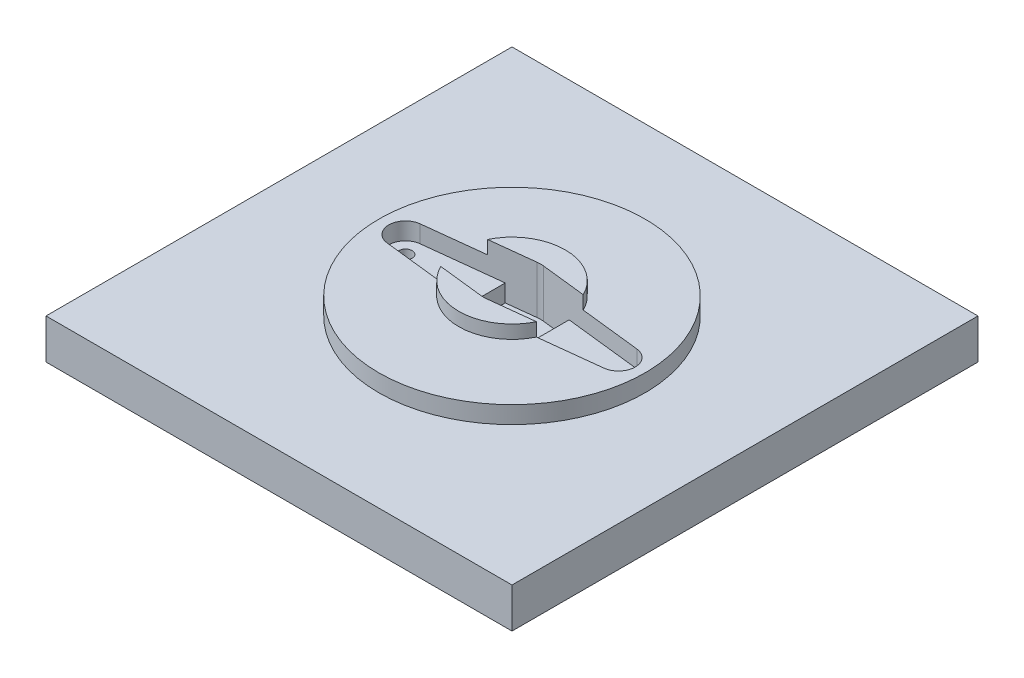
ISO-10303-21;
HEADER;
FILE_DESCRIPTION(('STEP AP214'),'2;1');
FILE_NAME('part.step','',(''),(''),'','','');
FILE_SCHEMA(('AUTOMOTIVE_DESIGN { 1 0 10303 214 1 1 1 1 }'));
ENDSEC;
DATA;
#1=APPLICATION_CONTEXT('core data for automotive mechanical design processes');
#2=APPLICATION_PROTOCOL_DEFINITION('international standard','automotive_design',2000,#1);
#3=PRODUCT_CONTEXT('',#1,'mechanical');
#4=PRODUCT('Part','Part','',(#3));
#5=PRODUCT_RELATED_PRODUCT_CATEGORY('part','',(#4));
#6=PRODUCT_DEFINITION_FORMATION('','',#4);
#7=PRODUCT_DEFINITION_CONTEXT('part definition',#1,'design');
#8=PRODUCT_DEFINITION('design','',#6,#7);
#9=PRODUCT_DEFINITION_SHAPE('','',#8);
#10=(LENGTH_UNIT() NAMED_UNIT(*) SI_UNIT(.MILLI.,.METRE.));
#11=(NAMED_UNIT(*) PLANE_ANGLE_UNIT() SI_UNIT($,.RADIAN.));
#12=(NAMED_UNIT(*) SI_UNIT($,.STERADIAN.) SOLID_ANGLE_UNIT());
#13=UNCERTAINTY_MEASURE_WITH_UNIT(LENGTH_MEASURE(1.E-05),#10,'distance_accuracy_value','');
#14=(GEOMETRIC_REPRESENTATION_CONTEXT(3) GLOBAL_UNCERTAINTY_ASSIGNED_CONTEXT((#13)) GLOBAL_UNIT_ASSIGNED_CONTEXT((#10,
#11,#12)) REPRESENTATION_CONTEXT('',''));
#15=CARTESIAN_POINT('',(0.,0.,0.));
#16=DIRECTION('',(0.,0.,1.));
#17=DIRECTION('',(1.,0.,0.));
#18=AXIS2_PLACEMENT_3D('',#15,#16,#17);
#19=CARTESIAN_POINT('',(0.,8.6,0.));
#20=DIRECTION('',(0.,1.,0.));
#21=DIRECTION('',(0.,0.,1.));
#22=AXIS2_PLACEMENT_3D('',#19,#20,#21);
#23=PLANE('',#22);
#24=CARTESIAN_POINT('',(0.,8.6,0.));
#25=DIRECTION('',(0.,1.,0.));
#26=DIRECTION('',(0.,0.,1.));
#27=AXIS2_PLACEMENT_3D('',#24,#25,#26);
#28=CIRCLE('',#27,20.);
#29=CARTESIAN_POINT('',(0.,8.6,20.));
#30=VERTEX_POINT('',#29);
#31=EDGE_CURVE('E385',#30,#30,#28,.T.);
#32=ORIENTED_EDGE('',*,*,#31,.T.);
#33=EDGE_LOOP('',(#32));
#34=FACE_BOUND('',#33,.T.);
#35=DIRECTION('',(-0.99365172470036,0.,0.1125));
#36=VECTOR('',#35,1.);
#37=CARTESIAN_POINT('',(-16.28125,8.6,-2.4841293117509));
#38=LINE('',#37,#36);
#39=CARTESIAN_POINT('',(-7.18703382678967,8.6,-3.51376504231302));
#40=VERTEX_POINT('',#39);
#41=CARTESIAN_POINT('',(-16.28125,8.6,-2.4841293117509));
#42=VERTEX_POINT('',#41);
#43=EDGE_CURVE('E327',#40,#42,#38,.T.);
#44=ORIENTED_EDGE('',*,*,#43,.F.);
#45=CARTESIAN_POINT('',(0.,8.6,0.));
#46=DIRECTION('',(0.,1.,0.));
#47=DIRECTION('',(0.,0.,1.));
#48=AXIS2_PLACEMENT_3D('',#45,#46,#47);
#49=CIRCLE('',#48,8.);
#50=CARTESIAN_POINT('',(7.18703382678967,8.6,-3.51376504231302));
#51=VERTEX_POINT('',#50);
#52=EDGE_CURVE('E56',#51,#40,#49,.T.);
#53=ORIENTED_EDGE('',*,*,#52,.F.);
#54=DIRECTION('',(-0.99365172470036,0.,-0.1125));
#55=VECTOR('',#54,1.);
#56=CARTESIAN_POINT('',(0.48375,8.6,-4.27270241621155));
#57=LINE('',#56,#55);
#58=CARTESIAN_POINT('',(16.28125,8.6,-2.4841293117509));
#59=VERTEX_POINT('',#58);
#60=EDGE_CURVE('E322',#59,#51,#57,.T.);
#61=ORIENTED_EDGE('',*,*,#60,.F.);
#62=CARTESIAN_POINT('',(16.,8.6,0.));
#63=DIRECTION('',(0.,1.,0.));
#64=DIRECTION('',(0.,0.,1.));
#65=AXIS2_PLACEMENT_3D('',#62,#63,#64);
#66=CIRCLE('',#65,2.5);
#67=CARTESIAN_POINT('',(16.28125,8.6,2.4841293117509));
#68=VERTEX_POINT('',#67);
#69=EDGE_CURVE('E319',#68,#59,#66,.T.);
#70=ORIENTED_EDGE('',*,*,#69,.F.);
#71=DIRECTION('',(0.99365172470036,0.,-0.1125));
#72=VECTOR('',#71,1.);
#73=CARTESIAN_POINT('',(0.48375,8.6,4.27270241621155));
#74=LINE('',#73,#72);
#75=CARTESIAN_POINT('',(7.18703382678967,8.6,3.51376504231302));
#76=VERTEX_POINT('',#75);
#77=EDGE_CURVE('E336',#76,#68,#74,.T.);
#78=ORIENTED_EDGE('',*,*,#77,.F.);
#79=CARTESIAN_POINT('',(0.,8.6,0.));
#80=DIRECTION('',(0.,1.,0.));
#81=DIRECTION('',(0.,0.,1.));
#82=AXIS2_PLACEMENT_3D('',#79,#80,#81);
#83=CIRCLE('',#82,8.);
#84=CARTESIAN_POINT('',(-7.18703382678967,8.6,3.51376504231302));
#85=VERTEX_POINT('',#84);
#86=EDGE_CURVE('E64',#85,#76,#83,.T.);
#87=ORIENTED_EDGE('',*,*,#86,.F.);
#88=DIRECTION('',(0.99365172470036,0.,0.1125));
#89=VECTOR('',#88,1.);
#90=CARTESIAN_POINT('',(-16.28125,8.6,2.4841293117509));
#91=LINE('',#90,#89);
#92=CARTESIAN_POINT('',(-16.28125,8.6,2.4841293117509));
#93=VERTEX_POINT('',#92);
#94=EDGE_CURVE('E333',#93,#85,#91,.T.);
#95=ORIENTED_EDGE('',*,*,#94,.F.);
#96=CARTESIAN_POINT('',(-16.,8.6,0.));
#97=DIRECTION('',(0.,1.,0.));
#98=DIRECTION('',(0.,0.,1.));
#99=AXIS2_PLACEMENT_3D('',#96,#97,#98);
#100=CIRCLE('',#99,2.5);
#101=EDGE_CURVE('E330',#42,#93,#100,.T.);
#102=ORIENTED_EDGE('',*,*,#101,.F.);
#103=EDGE_LOOP('',(#44,#53,#61,#70,#78,#87,#95,#102));
#104=FACE_BOUND('',#103,.T.);
#105=ADVANCED_FACE('F39',(#34,#104),#23,.T.);
#106=CARTESIAN_POINT('',(0.,0.,0.));
#107=DIRECTION('',(0.,1.,0.));
#108=DIRECTION('',(0.,0.,1.));
#109=AXIS2_PLACEMENT_3D('',#106,#107,#108);
#110=PLANE('',#109);
#111=DIRECTION('',(0.,0.,-1.));
#112=VECTOR('',#111,1.);
#113=CARTESIAN_POINT('',(35.,0.,-35.));
#114=LINE('',#113,#112);
#115=CARTESIAN_POINT('',(35.,0.,35.));
#116=VERTEX_POINT('',#115);
#117=CARTESIAN_POINT('',(35.,0.,-35.));
#118=VERTEX_POINT('',#117);
#119=EDGE_CURVE('E388',#116,#118,#114,.T.);
#120=ORIENTED_EDGE('',*,*,#119,.F.);
#121=DIRECTION('',(1.,0.,0.));
#122=VECTOR('',#121,1.);
#123=CARTESIAN_POINT('',(-35.,0.,35.));
#124=LINE('',#123,#122);
#125=CARTESIAN_POINT('',(-35.,0.,35.));
#126=VERTEX_POINT('',#125);
#127=EDGE_CURVE('E395',#126,#116,#124,.T.);
#128=ORIENTED_EDGE('',*,*,#127,.F.);
#129=DIRECTION('',(0.,0.,1.));
#130=VECTOR('',#129,1.);
#131=CARTESIAN_POINT('',(-35.,0.,-35.));
#132=LINE('',#131,#130);
#133=CARTESIAN_POINT('',(-35.,0.,-35.));
#134=VERTEX_POINT('',#133);
#135=EDGE_CURVE('E411',#134,#126,#132,.T.);
#136=ORIENTED_EDGE('',*,*,#135,.F.);
#137=DIRECTION('',(-1.,0.,0.));
#138=VECTOR('',#137,1.);
#139=CARTESIAN_POINT('',(-35.,0.,-35.));
#140=LINE('',#139,#138);
#141=EDGE_CURVE('E408',#118,#134,#140,.T.);
#142=ORIENTED_EDGE('',*,*,#141,.F.);
#143=EDGE_LOOP('',(#120,#128,#136,#142));
#144=FACE_BOUND('',#143,.T.);
#145=CARTESIAN_POINT('',(16.,0.,0.));
#146=DIRECTION('',(0.,1.,0.));
#147=DIRECTION('',(0.,0.,1.));
#148=AXIS2_PLACEMENT_3D('',#145,#146,#147);
#149=CIRCLE('',#148,3.5);
#150=CARTESIAN_POINT('',(16.,0.,3.5));
#151=VERTEX_POINT('',#150);
#152=EDGE_CURVE('E260',#151,#151,#149,.T.);
#153=ORIENTED_EDGE('',*,*,#152,.T.);
#154=EDGE_LOOP('',(#153));
#155=FACE_BOUND('',#154,.T.);
#156=CARTESIAN_POINT('',(-16.,0.,0.));
#157=DIRECTION('',(0.,-1.,0.));
#158=DIRECTION('',(0.,0.,-1.));
#159=AXIS2_PLACEMENT_3D('',#156,#157,#158);
#160=CIRCLE('',#159,3.5);
#161=CARTESIAN_POINT('',(-16.,0.,-3.5));
#162=VERTEX_POINT('',#161);
#163=EDGE_CURVE('E256',#162,#162,#160,.T.);
#164=ORIENTED_EDGE('',*,*,#163,.F.);
#165=EDGE_LOOP('',(#164));
#166=FACE_BOUND('',#165,.T.);
#167=ADVANCED_FACE('F440',(#144,#155,#166),#110,.F.);
#168=CARTESIAN_POINT('',(0.,6.,0.));
#169=DIRECTION('',(0.,1.,0.));
#170=DIRECTION('',(0.,0.,1.));
#171=AXIS2_PLACEMENT_3D('',#168,#169,#170);
#172=PLANE('',#171);
#173=CARTESIAN_POINT('',(16.,6.,0.));
#174=DIRECTION('',(0.,1.,0.));
#175=DIRECTION('',(0.,0.,1.));
#176=AXIS2_PLACEMENT_3D('',#173,#174,#175);
#177=CIRCLE('',#176,1.);
#178=CARTESIAN_POINT('',(16.,6.,1.));
#179=VERTEX_POINT('',#178);
#180=EDGE_CURVE('E235',#179,#179,#177,.T.);
#181=ORIENTED_EDGE('',*,*,#180,.F.);
#182=EDGE_LOOP('',(#181));
#183=FACE_BOUND('',#182,.T.);
#184=DIRECTION('',(0.,0.,-1.));
#185=VECTOR('',#184,1.);
#186=CARTESIAN_POINT('',(4.8,6.,-3.78402201348148));
#187=LINE('',#186,#185);
#188=CARTESIAN_POINT('',(4.8,6.,3.78402201348148));
#189=VERTEX_POINT('',#188);
#190=CARTESIAN_POINT('',(4.8,6.,-3.78402201348148));
#191=VERTEX_POINT('',#190);
#192=EDGE_CURVE('E255',#189,#191,#187,.T.);
#193=ORIENTED_EDGE('',*,*,#192,.F.);
#194=DIRECTION('',(0.99365172470036,0.,-0.1125));
#195=VECTOR('',#194,1.);
#196=CARTESIAN_POINT('',(0.48375,6.,4.27270241621155));
#197=LINE('',#196,#195);
#198=CARTESIAN_POINT('',(16.28125,6.,2.4841293117509));
#199=VERTEX_POINT('',#198);
#200=EDGE_CURVE('E323',#189,#199,#197,.T.);
#201=ORIENTED_EDGE('',*,*,#200,.T.);
#202=CARTESIAN_POINT('',(16.,6.,0.));
#203=DIRECTION('',(0.,1.,0.));
#204=DIRECTION('',(0.,0.,1.));
#205=AXIS2_PLACEMENT_3D('',#202,#203,#204);
#206=CIRCLE('',#205,2.5);
#207=CARTESIAN_POINT('',(16.28125,6.,-2.4841293117509));
#208=VERTEX_POINT('',#207);
#209=EDGE_CURVE('E310',#199,#208,#206,.T.);
#210=ORIENTED_EDGE('',*,*,#209,.T.);
#211=DIRECTION('',(-0.99365172470036,0.,-0.1125));
#212=VECTOR('',#211,1.);
#213=CARTESIAN_POINT('',(0.48375,6.,-4.27270241621155));
#214=LINE('',#213,#212);
#215=EDGE_CURVE('E343',#208,#191,#214,.T.);
#216=ORIENTED_EDGE('',*,*,#215,.T.);
#217=EDGE_LOOP('',(#193,#201,#210,#216));
#218=FACE_BOUND('',#217,.T.);
#219=ADVANCED_FACE('F453',(#183,#218),#172,.T.);
#220=CARTESIAN_POINT('',(35.,6.,-35.));
#221=DIRECTION('',(-1.,0.,0.));
#222=DIRECTION('',(0.,0.,1.));
#223=AXIS2_PLACEMENT_3D('',#220,#221,#222);
#224=PLANE('',#223);
#225=ORIENTED_EDGE('',*,*,#119,.T.);
#226=DIRECTION('',(0.,-1.,0.));
#227=VECTOR('',#226,1.);
#228=CARTESIAN_POINT('',(35.,6.,-35.));
#229=LINE('',#228,#227);
#230=CARTESIAN_POINT('',(35.,6.,-35.));
#231=VERTEX_POINT('',#230);
#232=EDGE_CURVE('E43',#231,#118,#229,.T.);
#233=ORIENTED_EDGE('',*,*,#232,.F.);
#234=DIRECTION('',(0.,0.,-1.));
#235=VECTOR('',#234,1.);
#236=CARTESIAN_POINT('',(35.,6.,-35.));
#237=LINE('',#236,#235);
#238=CARTESIAN_POINT('',(35.,6.,35.));
#239=VERTEX_POINT('',#238);
#240=EDGE_CURVE('E390',#239,#231,#237,.T.);
#241=ORIENTED_EDGE('',*,*,#240,.F.);
#242=DIRECTION('',(0.,-1.,0.));
#243=VECTOR('',#242,1.);
#244=CARTESIAN_POINT('',(35.,6.,35.));
#245=LINE('',#244,#243);
#246=EDGE_CURVE('E404',#239,#116,#245,.T.);
#247=ORIENTED_EDGE('',*,*,#246,.T.);
#248=EDGE_LOOP('',(#225,#233,#241,#247));
#249=FACE_BOUND('',#248,.T.);
#250=ADVANCED_FACE('F41',(#249),#224,.F.);
#251=CARTESIAN_POINT('',(-35.,6.,-35.));
#252=DIRECTION('',(0.,0.,1.));
#253=DIRECTION('',(1.,0.,0.));
#254=AXIS2_PLACEMENT_3D('',#251,#252,#253);
#255=PLANE('',#254);
#256=ORIENTED_EDGE('',*,*,#141,.T.);
#257=DIRECTION('',(0.,-1.,0.));
#258=VECTOR('',#257,1.);
#259=CARTESIAN_POINT('',(-35.,6.,-35.));
#260=LINE('',#259,#258);
#261=CARTESIAN_POINT('',(-35.,6.,-35.));
#262=VERTEX_POINT('',#261);
#263=EDGE_CURVE('E422',#262,#134,#260,.T.);
#264=ORIENTED_EDGE('',*,*,#263,.F.);
#265=DIRECTION('',(-1.,0.,0.));
#266=VECTOR('',#265,1.);
#267=CARTESIAN_POINT('',(-35.,6.,-35.));
#268=LINE('',#267,#266);
#269=EDGE_CURVE('E394',#231,#262,#268,.T.);
#270=ORIENTED_EDGE('',*,*,#269,.F.);
#271=ORIENTED_EDGE('',*,*,#232,.T.);
#272=EDGE_LOOP('',(#256,#264,#270,#271));
#273=FACE_BOUND('',#272,.T.);
#274=ADVANCED_FACE('F433',(#273),#255,.F.);
#275=CARTESIAN_POINT('',(-35.,6.,-35.));
#276=DIRECTION('',(1.,0.,0.));
#277=DIRECTION('',(0.,0.,-1.));
#278=AXIS2_PLACEMENT_3D('',#275,#276,#277);
#279=PLANE('',#278);
#280=ORIENTED_EDGE('',*,*,#135,.T.);
#281=DIRECTION('',(0.,-1.,0.));
#282=VECTOR('',#281,1.);
#283=CARTESIAN_POINT('',(-35.,6.,35.));
#284=LINE('',#283,#282);
#285=CARTESIAN_POINT('',(-35.,6.,35.));
#286=VERTEX_POINT('',#285);
#287=EDGE_CURVE('E419',#286,#126,#284,.T.);
#288=ORIENTED_EDGE('',*,*,#287,.F.);
#289=DIRECTION('',(0.,0.,1.));
#290=VECTOR('',#289,1.);
#291=CARTESIAN_POINT('',(-35.,6.,-35.));
#292=LINE('',#291,#290);
#293=EDGE_CURVE('E398',#262,#286,#292,.T.);
#294=ORIENTED_EDGE('',*,*,#293,.F.);
#295=ORIENTED_EDGE('',*,*,#263,.T.);
#296=EDGE_LOOP('',(#280,#288,#294,#295));
#297=FACE_BOUND('',#296,.T.);
#298=ADVANCED_FACE('F443',(#297),#279,.F.);
#299=CARTESIAN_POINT('',(-35.,6.,35.));
#300=DIRECTION('',(0.,0.,-1.));
#301=DIRECTION('',(-1.,0.,0.));
#302=AXIS2_PLACEMENT_3D('',#299,#300,#301);
#303=PLANE('',#302);
#304=ORIENTED_EDGE('',*,*,#127,.T.);
#305=ORIENTED_EDGE('',*,*,#246,.F.);
#306=DIRECTION('',(1.,0.,0.));
#307=VECTOR('',#306,1.);
#308=CARTESIAN_POINT('',(-35.,6.,35.));
#309=LINE('',#308,#307);
#310=EDGE_CURVE('E401',#286,#239,#309,.T.);
#311=ORIENTED_EDGE('',*,*,#310,.F.);
#312=ORIENTED_EDGE('',*,*,#287,.T.);
#313=EDGE_LOOP('',(#304,#305,#311,#312));
#314=FACE_BOUND('',#313,.T.);
#315=ADVANCED_FACE('F446',(#314),#303,.F.);
#316=CARTESIAN_POINT('',(0.,6.,0.));
#317=DIRECTION('',(0.,1.,0.));
#318=DIRECTION('',(0.,0.,1.));
#319=AXIS2_PLACEMENT_3D('',#316,#317,#318);
#320=CIRCLE('',#319,20.);
#321=CARTESIAN_POINT('',(0.,6.,20.));
#322=VERTEX_POINT('',#321);
#323=EDGE_CURVE('E11',#322,#322,#320,.T.);
#324=ORIENTED_EDGE('',*,*,#323,.F.);
#325=EDGE_LOOP('',(#324));
#326=FACE_BOUND('',#325,.T.);
#327=ORIENTED_EDGE('',*,*,#240,.T.);
#328=ORIENTED_EDGE('',*,*,#269,.T.);
#329=ORIENTED_EDGE('',*,*,#293,.T.);
#330=ORIENTED_EDGE('',*,*,#310,.T.);
#331=EDGE_LOOP('',(#327,#328,#329,#330));
#332=FACE_BOUND('',#331,.T.);
#333=ADVANCED_FACE('F448',(#326,#332),#172,.T.);
#334=CARTESIAN_POINT('',(0.,8.6,0.));
#335=DIRECTION('',(0.,-1.,0.));
#336=DIRECTION('',(0.,0.,-1.));
#337=AXIS2_PLACEMENT_3D('',#334,#335,#336);
#338=CYLINDRICAL_SURFACE('',#337,20.);
#339=ORIENTED_EDGE('',*,*,#31,.F.);
#340=EDGE_LOOP('',(#339));
#341=FACE_BOUND('',#340,.T.);
#342=ORIENTED_EDGE('',*,*,#323,.T.);
#343=EDGE_LOOP('',(#342));
#344=FACE_BOUND('',#343,.T.);
#345=ADVANCED_FACE('F450',(#341,#344),#338,.T.);
#346=CARTESIAN_POINT('',(16.,8.6,0.));
#347=DIRECTION('',(0.,-1.,0.));
#348=DIRECTION('',(0.,0.,-1.));
#349=AXIS2_PLACEMENT_3D('',#346,#347,#348);
#350=CYLINDRICAL_SURFACE('',#349,2.5);
#351=ORIENTED_EDGE('',*,*,#209,.F.);
#352=DIRECTION('',(0.,-1.,0.));
#353=VECTOR('',#352,1.);
#354=CARTESIAN_POINT('',(16.28125,8.6,2.4841293117509));
#355=LINE('',#354,#353);
#356=EDGE_CURVE('E339',#68,#199,#355,.T.);
#357=ORIENTED_EDGE('',*,*,#356,.F.);
#358=ORIENTED_EDGE('',*,*,#69,.T.);
#359=DIRECTION('',(0.,-1.,0.));
#360=VECTOR('',#359,1.);
#361=CARTESIAN_POINT('',(16.28125,8.6,-2.4841293117509));
#362=LINE('',#361,#360);
#363=EDGE_CURVE('E381',#59,#208,#362,.T.);
#364=ORIENTED_EDGE('',*,*,#363,.T.);
#365=EDGE_LOOP('',(#351,#357,#358,#364));
#366=FACE_BOUND('',#365,.T.);
#367=ADVANCED_FACE('F459',(#366),#350,.F.);
#368=CARTESIAN_POINT('',(0.48375,8.6,-4.27270241621155));
#369=DIRECTION('',(-0.1125,0.,0.99365172470036));
#370=DIRECTION('',(0.99365172470036,0.,0.1125));
#371=AXIS2_PLACEMENT_3D('',#368,#369,#370);
#372=PLANE('',#371);
#373=ORIENTED_EDGE('',*,*,#215,.F.);
#374=ORIENTED_EDGE('',*,*,#363,.F.);
#375=ORIENTED_EDGE('',*,*,#60,.T.);
#376=DIRECTION('',(0.,-1.,0.));
#377=VECTOR('',#376,1.);
#378=CARTESIAN_POINT('',(7.18703382678967,10.6,-3.51376504231302));
#379=LINE('',#378,#377);
#380=CARTESIAN_POINT('',(7.18703382678967,10.6,-3.51376504231302));
#381=VERTEX_POINT('',#380);
#382=EDGE_CURVE('E203',#381,#51,#379,.T.);
#383=ORIENTED_EDGE('',*,*,#382,.F.);
#384=DIRECTION('',(0.99365172470036,0.,0.1125));
#385=VECTOR('',#384,1.);
#386=CARTESIAN_POINT('',(7.18703382678967,10.6,-3.51376504231302));
#387=LINE('',#386,#385);
#388=CARTESIAN_POINT('',(0.483749999999999,10.6,-4.27270241621155));
#389=VERTEX_POINT('',#388);
#390=EDGE_CURVE('E197',#389,#381,#387,.T.);
#391=ORIENTED_EDGE('',*,*,#390,.F.);
#392=DIRECTION('',(0.,-1.,0.));
#393=VECTOR('',#392,1.);
#394=CARTESIAN_POINT('',(0.483749999999999,8.6,-4.27270241621155));
#395=LINE('',#394,#393);
#396=CARTESIAN_POINT('',(0.483749999999999,3.4,-4.27270241621155));
#397=VERTEX_POINT('',#396);
#398=EDGE_CURVE('E378',#389,#397,#395,.T.);
#399=ORIENTED_EDGE('',*,*,#398,.T.);
#400=DIRECTION('',(-0.99365172470036,0.,-0.1125));
#401=VECTOR('',#400,1.);
#402=CARTESIAN_POINT('',(4.8,3.4,-3.78402201348148));
#403=LINE('',#402,#401);
#404=CARTESIAN_POINT('',(4.8,3.4,-3.78402201348148));
#405=VERTEX_POINT('',#404);
#406=EDGE_CURVE('E276',#405,#397,#403,.T.);
#407=ORIENTED_EDGE('',*,*,#406,.F.);
#408=DIRECTION('',(0.,1.,0.));
#409=VECTOR('',#408,1.);
#410=CARTESIAN_POINT('',(4.8,3.4,-3.78402201348148));
#411=LINE('',#410,#409);
#412=EDGE_CURVE('E314',#405,#191,#411,.T.);
#413=ORIENTED_EDGE('',*,*,#412,.T.);
#414=EDGE_LOOP('',(#373,#374,#375,#383,#391,#399,#407,#413));
#415=FACE_BOUND('',#414,.T.);
#416=ADVANCED_FACE('F480',(#415),#372,.T.);
#417=CARTESIAN_POINT('',(0.,8.6,0.));
#418=DIRECTION('',(0.,-1.,0.));
#419=DIRECTION('',(0.,0.,-1.));
#420=AXIS2_PLACEMENT_3D('',#417,#418,#419);
#421=CYLINDRICAL_SURFACE('',#420,4.3);
#422=DIRECTION('',(0.,-1.,0.));
#423=VECTOR('',#422,1.);
#424=CARTESIAN_POINT('',(-0.48375,8.6,-4.27270241621155));
#425=LINE('',#424,#423);
#426=CARTESIAN_POINT('',(-0.48375,10.6,-4.27270241621155));
#427=VERTEX_POINT('',#426);
#428=CARTESIAN_POINT('',(-0.483749999999998,3.4,-4.27270241621155));
#429=VERTEX_POINT('',#428);
#430=EDGE_CURVE('E186',#427,#429,#425,.T.);
#431=ORIENTED_EDGE('',*,*,#430,.T.);
#432=CARTESIAN_POINT('',(0.,3.4,0.));
#433=DIRECTION('',(0.,1.,0.));
#434=DIRECTION('',(0.,0.,1.));
#435=AXIS2_PLACEMENT_3D('',#432,#433,#434);
#436=CIRCLE('',#435,4.3);
#437=EDGE_CURVE('E280',#397,#429,#436,.T.);
#438=ORIENTED_EDGE('',*,*,#437,.F.);
#439=ORIENTED_EDGE('',*,*,#398,.F.);
#440=CARTESIAN_POINT('',(0.,10.6,0.));
#441=DIRECTION('',(0.,-1.,0.));
#442=DIRECTION('',(0.,0.,1.));
#443=AXIS2_PLACEMENT_3D('',#440,#441,#442);
#444=CIRCLE('',#443,4.3);
#445=EDGE_CURVE('E191',#427,#389,#444,.T.);
#446=ORIENTED_EDGE('',*,*,#445,.F.);
#447=EDGE_LOOP('',(#431,#438,#439,#446));
#448=FACE_BOUND('',#447,.T.);
#449=ADVANCED_FACE('F484',(#448),#421,.F.);
#450=CARTESIAN_POINT('',(-16.28125,8.6,-2.4841293117509));
#451=DIRECTION('',(0.1125,0.,0.99365172470036));
#452=DIRECTION('',(0.99365172470036,0.,-0.1125));
#453=AXIS2_PLACEMENT_3D('',#450,#451,#452);
#454=PLANE('',#453);
#455=DIRECTION('',(-0.99365172470036,0.,0.1125));
#456=VECTOR('',#455,1.);
#457=CARTESIAN_POINT('',(-16.28125,6.,-2.4841293117509));
#458=LINE('',#457,#456);
#459=CARTESIAN_POINT('',(-4.8,6.,-3.78402201348148));
#460=VERTEX_POINT('',#459);
#461=CARTESIAN_POINT('',(-16.28125,6.,-2.4841293117509));
#462=VERTEX_POINT('',#461);
#463=EDGE_CURVE('E347',#460,#462,#458,.T.);
#464=ORIENTED_EDGE('',*,*,#463,.F.);
#465=DIRECTION('',(0.,1.,0.));
#466=VECTOR('',#465,1.);
#467=CARTESIAN_POINT('',(-4.8,3.4,-3.78402201348148));
#468=LINE('',#467,#466);
#469=CARTESIAN_POINT('',(-4.8,3.4,-3.78402201348148));
#470=VERTEX_POINT('',#469);
#471=EDGE_CURVE('E311',#470,#460,#468,.T.);
#472=ORIENTED_EDGE('',*,*,#471,.F.);
#473=DIRECTION('',(-0.99365172470036,0.,0.1125));
#474=VECTOR('',#473,1.);
#475=CARTESIAN_POINT('',(-0.48375,3.4,-4.27270241621155));
#476=LINE('',#475,#474);
#477=EDGE_CURVE('E284',#429,#470,#476,.T.);
#478=ORIENTED_EDGE('',*,*,#477,.F.);
#479=ORIENTED_EDGE('',*,*,#430,.F.);
#480=DIRECTION('',(0.99365172470036,0.,-0.1125));
#481=VECTOR('',#480,1.);
#482=CARTESIAN_POINT('',(-0.48375,10.6,-4.27270241621155));
#483=LINE('',#482,#481);
#484=CARTESIAN_POINT('',(-7.18703382678967,10.6,-3.51376504231302));
#485=VERTEX_POINT('',#484);
#486=EDGE_CURVE('E179',#485,#427,#483,.T.);
#487=ORIENTED_EDGE('',*,*,#486,.F.);
#488=DIRECTION('',(0.,-1.,0.));
#489=VECTOR('',#488,1.);
#490=CARTESIAN_POINT('',(-7.18703382678967,10.6,-3.51376504231302));
#491=LINE('',#490,#489);
#492=EDGE_CURVE('E183',#485,#40,#491,.T.);
#493=ORIENTED_EDGE('',*,*,#492,.T.);
#494=ORIENTED_EDGE('',*,*,#43,.T.);
#495=DIRECTION('',(0.,-1.,0.));
#496=VECTOR('',#495,1.);
#497=CARTESIAN_POINT('',(-16.28125,8.6,-2.4841293117509));
#498=LINE('',#497,#496);
#499=EDGE_CURVE('E372',#42,#462,#498,.T.);
#500=ORIENTED_EDGE('',*,*,#499,.T.);
#501=EDGE_LOOP('',(#464,#472,#478,#479,#487,#493,#494,#500));
#502=FACE_BOUND('',#501,.T.);
#503=ADVANCED_FACE('F182',(#502),#454,.T.);
#504=CARTESIAN_POINT('',(-16.,8.6,0.));
#505=DIRECTION('',(0.,-1.,0.));
#506=DIRECTION('',(0.,0.,-1.));
#507=AXIS2_PLACEMENT_3D('',#504,#505,#506);
#508=CYLINDRICAL_SURFACE('',#507,2.5);
#509=CARTESIAN_POINT('',(-16.,6.,0.));
#510=DIRECTION('',(0.,1.,0.));
#511=DIRECTION('',(0.,0.,1.));
#512=AXIS2_PLACEMENT_3D('',#509,#510,#511);
#513=CIRCLE('',#512,2.5);
#514=CARTESIAN_POINT('',(-16.28125,6.,2.4841293117509));
#515=VERTEX_POINT('',#514);
#516=EDGE_CURVE('E350',#462,#515,#513,.T.);
#517=ORIENTED_EDGE('',*,*,#516,.F.);
#518=ORIENTED_EDGE('',*,*,#499,.F.);
#519=ORIENTED_EDGE('',*,*,#101,.T.);
#520=DIRECTION('',(0.,-1.,0.));
#521=VECTOR('',#520,1.);
#522=CARTESIAN_POINT('',(-16.28125,8.6,2.4841293117509));
#523=LINE('',#522,#521);
#524=EDGE_CURVE('E369',#93,#515,#523,.T.);
#525=ORIENTED_EDGE('',*,*,#524,.T.);
#526=EDGE_LOOP('',(#517,#518,#519,#525));
#527=FACE_BOUND('',#526,.T.);
#528=ADVANCED_FACE('F491',(#527),#508,.F.);
#529=CARTESIAN_POINT('',(-16.28125,8.6,2.4841293117509));
#530=DIRECTION('',(0.1125,0.,-0.99365172470036));
#531=DIRECTION('',(-0.99365172470036,0.,-0.1125));
#532=AXIS2_PLACEMENT_3D('',#529,#530,#531);
#533=PLANE('',#532);
#534=DIRECTION('',(0.99365172470036,0.,0.1125));
#535=VECTOR('',#534,1.);
#536=CARTESIAN_POINT('',(-16.28125,6.,2.4841293117509));
#537=LINE('',#536,#535);
#538=CARTESIAN_POINT('',(-4.8,6.,3.78402201348148));
#539=VERTEX_POINT('',#538);
#540=EDGE_CURVE('E354',#515,#539,#537,.T.);
#541=ORIENTED_EDGE('',*,*,#540,.F.);
#542=ORIENTED_EDGE('',*,*,#524,.F.);
#543=ORIENTED_EDGE('',*,*,#94,.T.);
#544=DIRECTION('',(0.,-1.,0.));
#545=VECTOR('',#544,1.);
#546=CARTESIAN_POINT('',(-7.18703382678967,10.6,3.51376504231302));
#547=LINE('',#546,#545);
#548=CARTESIAN_POINT('',(-7.18703382678967,10.6,3.51376504231302));
#549=VERTEX_POINT('',#548);
#550=EDGE_CURVE('E225',#549,#85,#547,.T.);
#551=ORIENTED_EDGE('',*,*,#550,.F.);
#552=DIRECTION('',(-0.99365172470036,0.,-0.1125));
#553=VECTOR('',#552,1.);
#554=CARTESIAN_POINT('',(-7.18703382678967,10.6,3.51376504231302));
#555=LINE('',#554,#553);
#556=CARTESIAN_POINT('',(-0.483750000000002,10.6,4.27270241621155));
#557=VERTEX_POINT('',#556);
#558=EDGE_CURVE('E223',#557,#549,#555,.T.);
#559=ORIENTED_EDGE('',*,*,#558,.F.);
#560=DIRECTION('',(0.,-1.,0.));
#561=VECTOR('',#560,1.);
#562=CARTESIAN_POINT('',(-0.483750000000002,8.6,4.27270241621155));
#563=LINE('',#562,#561);
#564=CARTESIAN_POINT('',(-0.483750000000002,3.4,4.27270241621155));
#565=VERTEX_POINT('',#564);
#566=EDGE_CURVE('E366',#557,#565,#563,.T.);
#567=ORIENTED_EDGE('',*,*,#566,.T.);
#568=DIRECTION('',(0.99365172470036,0.,0.1125));
#569=VECTOR('',#568,1.);
#570=CARTESIAN_POINT('',(-4.8,3.4,3.78402201348148));
#571=LINE('',#570,#569);
#572=CARTESIAN_POINT('',(-4.8,3.4,3.78402201348148));
#573=VERTEX_POINT('',#572);
#574=EDGE_CURVE('E292',#573,#565,#571,.T.);
#575=ORIENTED_EDGE('',*,*,#574,.F.);
#576=DIRECTION('',(0.,1.,0.));
#577=VECTOR('',#576,1.);
#578=CARTESIAN_POINT('',(-4.8,3.4,3.78402201348148));
#579=LINE('',#578,#577);
#580=EDGE_CURVE('E307',#573,#539,#579,.T.);
#581=ORIENTED_EDGE('',*,*,#580,.T.);
#582=EDGE_LOOP('',(#541,#542,#543,#551,#559,#567,#575,#581));
#583=FACE_BOUND('',#582,.T.);
#584=ADVANCED_FACE('F494',(#583),#533,.T.);
#585=CARTESIAN_POINT('',(0.,8.6,0.));
#586=DIRECTION('',(0.,-1.,0.));
#587=DIRECTION('',(0.,0.,-1.));
#588=AXIS2_PLACEMENT_3D('',#585,#586,#587);
#589=CYLINDRICAL_SURFACE('',#588,4.3);
#590=DIRECTION('',(0.,-1.,0.));
#591=VECTOR('',#590,1.);
#592=CARTESIAN_POINT('',(0.48375,8.6,4.27270241621155));
#593=LINE('',#592,#591);
#594=CARTESIAN_POINT('',(0.483750000000001,10.6,4.27270241621155));
#595=VERTEX_POINT('',#594);
#596=CARTESIAN_POINT('',(0.483750000000001,3.4,4.27270241621155));
#597=VERTEX_POINT('',#596);
#598=EDGE_CURVE('E363',#595,#597,#593,.T.);
#599=ORIENTED_EDGE('',*,*,#598,.T.);
#600=CARTESIAN_POINT('',(0.,3.4,0.));
#601=DIRECTION('',(0.,1.,0.));
#602=DIRECTION('',(0.,0.,1.));
#603=AXIS2_PLACEMENT_3D('',#600,#601,#602);
#604=CIRCLE('',#603,4.3);
#605=EDGE_CURVE('E296',#565,#597,#604,.T.);
#606=ORIENTED_EDGE('',*,*,#605,.F.);
#607=ORIENTED_EDGE('',*,*,#566,.F.);
#608=CARTESIAN_POINT('',(0.,10.6,0.));
#609=DIRECTION('',(0.,-1.,0.));
#610=DIRECTION('',(0.,0.,1.));
#611=AXIS2_PLACEMENT_3D('',#608,#609,#610);
#612=CIRCLE('',#611,4.3);
#613=EDGE_CURVE('E219',#595,#557,#612,.T.);
#614=ORIENTED_EDGE('',*,*,#613,.F.);
#615=EDGE_LOOP('',(#599,#606,#607,#614));
#616=FACE_BOUND('',#615,.T.);
#617=ADVANCED_FACE('F498',(#616),#589,.F.);
#618=CARTESIAN_POINT('',(0.48375,8.6,4.27270241621155));
#619=DIRECTION('',(-0.1125,0.,-0.99365172470036));
#620=DIRECTION('',(-0.99365172470036,0.,0.1125));
#621=AXIS2_PLACEMENT_3D('',#618,#619,#620);
#622=PLANE('',#621);
#623=ORIENTED_EDGE('',*,*,#200,.F.);
#624=DIRECTION('',(0.,1.,0.));
#625=VECTOR('',#624,1.);
#626=CARTESIAN_POINT('',(4.8,3.4,3.78402201348148));
#627=LINE('',#626,#625);
#628=CARTESIAN_POINT('',(4.8,3.4,3.78402201348148));
#629=VERTEX_POINT('',#628);
#630=EDGE_CURVE('E300',#629,#189,#627,.T.);
#631=ORIENTED_EDGE('',*,*,#630,.F.);
#632=DIRECTION('',(0.99365172470036,0.,-0.1125));
#633=VECTOR('',#632,1.);
#634=CARTESIAN_POINT('',(0.48375,3.4,4.27270241621155));
#635=LINE('',#634,#633);
#636=EDGE_CURVE('E267',#597,#629,#635,.T.);
#637=ORIENTED_EDGE('',*,*,#636,.F.);
#638=ORIENTED_EDGE('',*,*,#598,.F.);
#639=DIRECTION('',(-0.99365172470036,0.,0.1125));
#640=VECTOR('',#639,1.);
#641=CARTESIAN_POINT('',(0.483750000000001,10.6,4.27270241621155));
#642=LINE('',#641,#640);
#643=CARTESIAN_POINT('',(7.18703382678967,10.6,3.51376504231302));
#644=VERTEX_POINT('',#643);
#645=EDGE_CURVE('E215',#644,#595,#642,.T.);
#646=ORIENTED_EDGE('',*,*,#645,.F.);
#647=DIRECTION('',(0.,-1.,0.));
#648=VECTOR('',#647,1.);
#649=CARTESIAN_POINT('',(7.18703382678967,10.6,3.51376504231302));
#650=LINE('',#649,#648);
#651=EDGE_CURVE('E230',#644,#76,#650,.T.);
#652=ORIENTED_EDGE('',*,*,#651,.T.);
#653=ORIENTED_EDGE('',*,*,#77,.T.);
#654=ORIENTED_EDGE('',*,*,#356,.T.);
#655=EDGE_LOOP('',(#623,#631,#637,#638,#646,#652,#653,#654));
#656=FACE_BOUND('',#655,.T.);
#657=ADVANCED_FACE('F469',(#656),#622,.T.);
#658=CARTESIAN_POINT('',(-16.,6.,0.));
#659=DIRECTION('',(0.,1.,0.));
#660=DIRECTION('',(0.,0.,-1.));
#661=AXIS2_PLACEMENT_3D('',#658,#659,#660);
#662=CIRCLE('',#661,1.);
#663=CARTESIAN_POINT('',(-16.,6.,-1.));
#664=VERTEX_POINT('',#663);
#665=EDGE_CURVE('E234',#664,#664,#662,.T.);
#666=ORIENTED_EDGE('',*,*,#665,.F.);
#667=EDGE_LOOP('',(#666));
#668=FACE_BOUND('',#667,.T.);
#669=DIRECTION('',(0.,0.,1.));
#670=VECTOR('',#669,1.);
#671=CARTESIAN_POINT('',(-4.8,6.,-3.78402201348148));
#672=LINE('',#671,#670);
#673=EDGE_CURVE('E272',#460,#539,#672,.T.);
#674=ORIENTED_EDGE('',*,*,#673,.F.);
#675=ORIENTED_EDGE('',*,*,#463,.T.);
#676=ORIENTED_EDGE('',*,*,#516,.T.);
#677=ORIENTED_EDGE('',*,*,#540,.T.);
#678=EDGE_LOOP('',(#674,#675,#676,#677));
#679=FACE_BOUND('',#678,.T.);
#680=ADVANCED_FACE('F454',(#668,#679),#172,.T.);
#681=CARTESIAN_POINT('',(-4.8,3.4,-3.78402201348148));
#682=DIRECTION('',(-1.,0.,0.));
#683=DIRECTION('',(0.,0.,1.));
#684=AXIS2_PLACEMENT_3D('',#681,#682,#683);
#685=PLANE('',#684);
#686=ORIENTED_EDGE('',*,*,#673,.T.);
#687=ORIENTED_EDGE('',*,*,#580,.F.);
#688=DIRECTION('',(0.,0.,1.));
#689=VECTOR('',#688,1.);
#690=CARTESIAN_POINT('',(-4.8,3.4,-3.78402201348148));
#691=LINE('',#690,#689);
#692=EDGE_CURVE('E288',#470,#573,#691,.T.);
#693=ORIENTED_EDGE('',*,*,#692,.F.);
#694=ORIENTED_EDGE('',*,*,#471,.T.);
#695=EDGE_LOOP('',(#686,#687,#693,#694));
#696=FACE_BOUND('',#695,.T.);
#697=ADVANCED_FACE('F468',(#696),#685,.F.);
#698=CARTESIAN_POINT('',(4.8,3.4,-3.78402201348148));
#699=DIRECTION('',(1.,0.,0.));
#700=DIRECTION('',(0.,0.,-1.));
#701=AXIS2_PLACEMENT_3D('',#698,#699,#700);
#702=PLANE('',#701);
#703=ORIENTED_EDGE('',*,*,#192,.T.);
#704=ORIENTED_EDGE('',*,*,#412,.F.);
#705=DIRECTION('',(0.,0.,-1.));
#706=VECTOR('',#705,1.);
#707=CARTESIAN_POINT('',(4.8,3.4,-3.78402201348148));
#708=LINE('',#707,#706);
#709=EDGE_CURVE('E271',#629,#405,#708,.T.);
#710=ORIENTED_EDGE('',*,*,#709,.F.);
#711=ORIENTED_EDGE('',*,*,#630,.T.);
#712=EDGE_LOOP('',(#703,#704,#710,#711));
#713=FACE_BOUND('',#712,.T.);
#714=ADVANCED_FACE('F506',(#713),#702,.F.);
#715=CARTESIAN_POINT('',(0.,3.4,0.));
#716=DIRECTION('',(0.,1.,0.));
#717=DIRECTION('',(0.,0.,1.));
#718=AXIS2_PLACEMENT_3D('',#715,#716,#717);
#719=PLANE('',#718);
#720=ORIENTED_EDGE('',*,*,#636,.T.);
#721=ORIENTED_EDGE('',*,*,#709,.T.);
#722=ORIENTED_EDGE('',*,*,#406,.T.);
#723=ORIENTED_EDGE('',*,*,#437,.T.);
#724=ORIENTED_EDGE('',*,*,#477,.T.);
#725=ORIENTED_EDGE('',*,*,#692,.T.);
#726=ORIENTED_EDGE('',*,*,#574,.T.);
#727=ORIENTED_EDGE('',*,*,#605,.T.);
#728=EDGE_LOOP('',(#720,#721,#722,#723,#724,#725,#726,#727));
#729=FACE_BOUND('',#728,.T.);
#730=ADVANCED_FACE('F509',(#729),#719,.T.);
#731=CARTESIAN_POINT('',(16.,1.6,0.));
#732=DIRECTION('',(0.,-1.,0.));
#733=DIRECTION('',(0.,0.,-1.));
#734=AXIS2_PLACEMENT_3D('',#731,#732,#733);
#735=CYLINDRICAL_SURFACE('',#734,3.5);
#736=CARTESIAN_POINT('',(16.,1.6,0.));
#737=DIRECTION('',(0.,1.,0.));
#738=DIRECTION('',(0.,0.,1.));
#739=AXIS2_PLACEMENT_3D('',#736,#737,#738);
#740=CIRCLE('',#739,3.5);
#741=CARTESIAN_POINT('',(16.,1.6,3.5));
#742=VERTEX_POINT('',#741);
#743=EDGE_CURVE('E244',#742,#742,#740,.T.);
#744=ORIENTED_EDGE('',*,*,#743,.T.);
#745=EDGE_LOOP('',(#744));
#746=FACE_BOUND('',#745,.T.);
#747=ORIENTED_EDGE('',*,*,#152,.F.);
#748=EDGE_LOOP('',(#747));
#749=FACE_BOUND('',#748,.T.);
#750=ADVANCED_FACE('F516',(#746,#749),#735,.F.);
#751=CARTESIAN_POINT('',(16.,1.6,0.));
#752=DIRECTION('',(0.,1.,0.));
#753=DIRECTION('',(0.,0.,1.));
#754=AXIS2_PLACEMENT_3D('',#751,#752,#753);
#755=PLANE('',#754);
#756=CARTESIAN_POINT('',(16.,1.6,0.));
#757=DIRECTION('',(0.,-1.,0.));
#758=DIRECTION('',(0.,0.,-1.));
#759=AXIS2_PLACEMENT_3D('',#756,#757,#758);
#760=CIRCLE('',#759,1.);
#761=CARTESIAN_POINT('',(16.,1.6,-1.));
#762=VERTEX_POINT('',#761);
#763=EDGE_CURVE('E239',#762,#762,#760,.F.);
#764=ORIENTED_EDGE('',*,*,#763,.T.);
#765=EDGE_LOOP('',(#764));
#766=FACE_BOUND('',#765,.T.);
#767=ORIENTED_EDGE('',*,*,#743,.F.);
#768=EDGE_LOOP('',(#767));
#769=FACE_BOUND('',#768,.T.);
#770=ADVANCED_FACE('F518',(#766,#769),#755,.F.);
#771=CARTESIAN_POINT('',(-16.,1.6,0.));
#772=DIRECTION('',(0.,-1.,0.));
#773=DIRECTION('',(0.,0.,-1.));
#774=AXIS2_PLACEMENT_3D('',#771,#772,#773);
#775=CYLINDRICAL_SURFACE('',#774,3.5);
#776=CARTESIAN_POINT('',(-16.,1.6,0.));
#777=DIRECTION('',(0.,-1.,0.));
#778=DIRECTION('',(0.,0.,-1.));
#779=AXIS2_PLACEMENT_3D('',#776,#777,#778);
#780=CIRCLE('',#779,3.5);
#781=CARTESIAN_POINT('',(-16.,1.6,-3.5));
#782=VERTEX_POINT('',#781);
#783=EDGE_CURVE('E251',#782,#782,#780,.T.);
#784=ORIENTED_EDGE('',*,*,#783,.F.);
#785=EDGE_LOOP('',(#784));
#786=FACE_BOUND('',#785,.T.);
#787=ORIENTED_EDGE('',*,*,#163,.T.);
#788=EDGE_LOOP('',(#787));
#789=FACE_BOUND('',#788,.T.);
#790=ADVANCED_FACE('F521',(#786,#789),#775,.F.);
#791=CARTESIAN_POINT('',(0.,1.6,0.));
#792=DIRECTION('',(0.,-1.,0.));
#793=DIRECTION('',(0.,0.,-1.));
#794=AXIS2_PLACEMENT_3D('',#791,#792,#793);
#795=PLANE('',#794);
#796=CARTESIAN_POINT('',(-16.,1.6,0.));
#797=DIRECTION('',(0.,-1.,0.));
#798=DIRECTION('',(0.,0.,-1.));
#799=AXIS2_PLACEMENT_3D('',#796,#797,#798);
#800=CIRCLE('',#799,1.);
#801=CARTESIAN_POINT('',(-16.,1.6,-1.));
#802=VERTEX_POINT('',#801);
#803=EDGE_CURVE('E240',#802,#802,#800,.F.);
#804=ORIENTED_EDGE('',*,*,#803,.T.);
#805=EDGE_LOOP('',(#804));
#806=FACE_BOUND('',#805,.T.);
#807=ORIENTED_EDGE('',*,*,#783,.T.);
#808=EDGE_LOOP('',(#807));
#809=FACE_BOUND('',#808,.T.);
#810=ADVANCED_FACE('F528',(#806,#809),#795,.T.);
#811=CARTESIAN_POINT('',(-16.,-1.22842712474619,0.));
#812=DIRECTION('',(0.,1.,0.));
#813=DIRECTION('',(0.,0.,1.));
#814=AXIS2_PLACEMENT_3D('',#811,#812,#813);
#815=CYLINDRICAL_SURFACE('',#814,1.);
#816=ORIENTED_EDGE('',*,*,#665,.T.);
#817=EDGE_LOOP('',(#816));
#818=FACE_BOUND('',#817,.T.);
#819=ORIENTED_EDGE('',*,*,#803,.F.);
#820=EDGE_LOOP('',(#819));
#821=FACE_BOUND('',#820,.T.);
#822=ADVANCED_FACE('F532',(#818,#821),#815,.F.);
#823=CARTESIAN_POINT('',(16.,-1.22842712474619,0.));
#824=DIRECTION('',(0.,1.,0.));
#825=DIRECTION('',(0.,0.,1.));
#826=AXIS2_PLACEMENT_3D('',#823,#824,#825);
#827=CYLINDRICAL_SURFACE('',#826,1.);
#828=ORIENTED_EDGE('',*,*,#180,.T.);
#829=EDGE_LOOP('',(#828));
#830=FACE_BOUND('',#829,.T.);
#831=ORIENTED_EDGE('',*,*,#763,.F.);
#832=EDGE_LOOP('',(#831));
#833=FACE_BOUND('',#832,.T.);
#834=ADVANCED_FACE('F536',(#830,#833),#827,.F.);
#835=CARTESIAN_POINT('',(0.,10.6,0.));
#836=DIRECTION('',(0.,-1.,0.));
#837=DIRECTION('',(0.,0.,-1.));
#838=AXIS2_PLACEMENT_3D('',#835,#836,#837);
#839=CYLINDRICAL_SURFACE('',#838,8.);
#840=ORIENTED_EDGE('',*,*,#86,.T.);
#841=ORIENTED_EDGE('',*,*,#651,.F.);
#842=CARTESIAN_POINT('',(0.,10.6,0.));
#843=DIRECTION('',(0.,1.,0.));
#844=DIRECTION('',(0.,0.,1.));
#845=AXIS2_PLACEMENT_3D('',#842,#843,#844);
#846=CIRCLE('',#845,8.);
#847=EDGE_CURVE('E207',#549,#644,#846,.T.);
#848=ORIENTED_EDGE('',*,*,#847,.F.);
#849=ORIENTED_EDGE('',*,*,#550,.T.);
#850=EDGE_LOOP('',(#840,#841,#848,#849));
#851=FACE_BOUND('',#850,.T.);
#852=ADVANCED_FACE('F540',(#851),#839,.T.);
#853=CARTESIAN_POINT('',(0.,10.6,0.));
#854=DIRECTION('',(0.,1.,0.));
#855=DIRECTION('',(0.,0.,1.));
#856=AXIS2_PLACEMENT_3D('',#853,#854,#855);
#857=PLANE('',#856);
#858=ORIENTED_EDGE('',*,*,#847,.T.);
#859=ORIENTED_EDGE('',*,*,#645,.T.);
#860=ORIENTED_EDGE('',*,*,#613,.T.);
#861=ORIENTED_EDGE('',*,*,#558,.T.);
#862=EDGE_LOOP('',(#858,#859,#860,#861));
#863=FACE_BOUND('',#862,.T.);
#864=ADVANCED_FACE('F544',(#863),#857,.T.);
#865=CARTESIAN_POINT('',(0.,10.6,0.));
#866=DIRECTION('',(0.,-1.,0.));
#867=DIRECTION('',(0.,0.,-1.));
#868=AXIS2_PLACEMENT_3D('',#865,#866,#867);
#869=CYLINDRICAL_SURFACE('',#868,8.);
#870=ORIENTED_EDGE('',*,*,#52,.T.);
#871=ORIENTED_EDGE('',*,*,#492,.F.);
#872=CARTESIAN_POINT('',(0.,10.6,0.));
#873=DIRECTION('',(0.,1.,0.));
#874=DIRECTION('',(0.,0.,1.));
#875=AXIS2_PLACEMENT_3D('',#872,#873,#874);
#876=CIRCLE('',#875,8.);
#877=EDGE_CURVE('E192',#381,#485,#876,.T.);
#878=ORIENTED_EDGE('',*,*,#877,.F.);
#879=ORIENTED_EDGE('',*,*,#382,.T.);
#880=EDGE_LOOP('',(#870,#871,#878,#879));
#881=FACE_BOUND('',#880,.T.);
#882=ADVANCED_FACE('F201',(#881),#869,.T.);
#883=CARTESIAN_POINT('',(0.,10.6,0.));
#884=DIRECTION('',(0.,1.,0.));
#885=DIRECTION('',(0.,0.,1.));
#886=AXIS2_PLACEMENT_3D('',#883,#884,#885);
#887=PLANE('',#886);
#888=ORIENTED_EDGE('',*,*,#877,.T.);
#889=ORIENTED_EDGE('',*,*,#486,.T.);
#890=ORIENTED_EDGE('',*,*,#445,.T.);
#891=ORIENTED_EDGE('',*,*,#390,.T.);
#892=EDGE_LOOP('',(#888,#889,#890,#891));
#893=FACE_BOUND('',#892,.T.);
#894=ADVANCED_FACE('F195',(#893),#887,.T.);
#895=CLOSED_SHELL('',(#105,#167,#219,#250,#274,#298,#315,#333,#345,#367,#416,#449,#503,#528,
#584,#617,#657,#680,#697,#714,#730,#750,#770,#790,#810,#822,#834,#852,#864,#882,#894));
#896=MANIFOLD_SOLID_BREP('B2',#895);
#897=ADVANCED_BREP_SHAPE_REPRESENTATION('',(#18,#896),#14);
#898=SHAPE_DEFINITION_REPRESENTATION(#9,#897);
ENDSEC;
END-ISO-10303-21;
